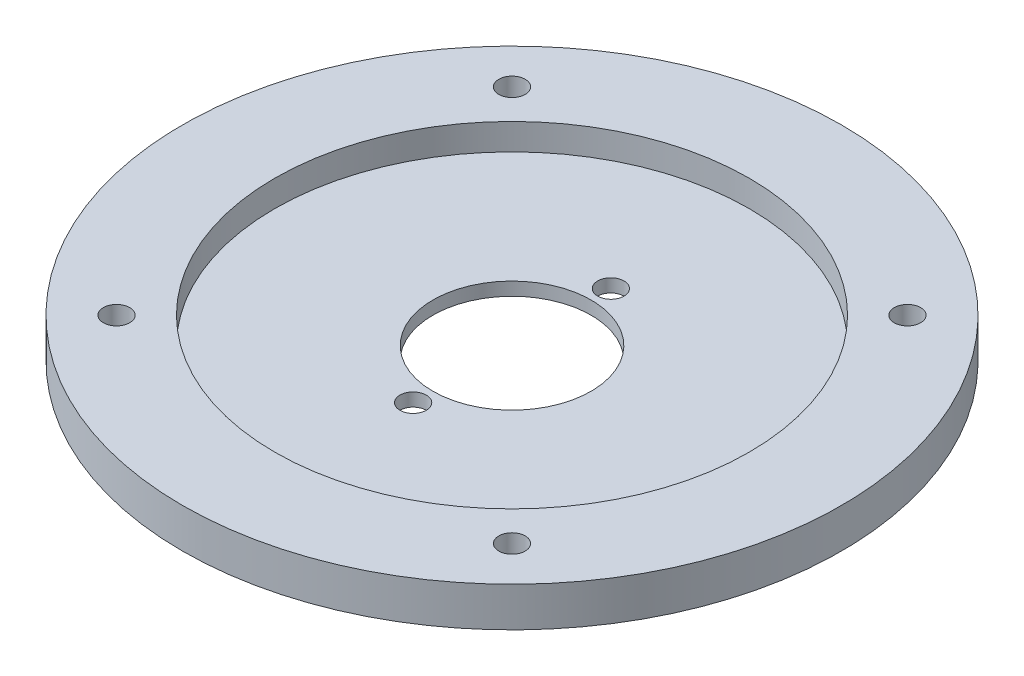
ISO-10303-21;
HEADER;
FILE_DESCRIPTION(('STEP AP214'),'2;1');
FILE_NAME('part.step','',(''),(''),'','','');
FILE_SCHEMA(('AUTOMOTIVE_DESIGN { 1 0 10303 214 1 1 1 1 }'));
ENDSEC;
DATA;
#1=APPLICATION_CONTEXT('core data for automotive mechanical design processes');
#2=APPLICATION_PROTOCOL_DEFINITION('international standard','automotive_design',2000,#1);
#3=PRODUCT_CONTEXT('',#1,'mechanical');
#4=PRODUCT('Part','Part','',(#3));
#5=PRODUCT_RELATED_PRODUCT_CATEGORY('part','',(#4));
#6=PRODUCT_DEFINITION_FORMATION('','',#4);
#7=PRODUCT_DEFINITION_CONTEXT('part definition',#1,'design');
#8=PRODUCT_DEFINITION('design','',#6,#7);
#9=PRODUCT_DEFINITION_SHAPE('','',#8);
#10=(LENGTH_UNIT() NAMED_UNIT(*) SI_UNIT(.MILLI.,.METRE.));
#11=(NAMED_UNIT(*) PLANE_ANGLE_UNIT() SI_UNIT($,.RADIAN.));
#12=(NAMED_UNIT(*) SI_UNIT($,.STERADIAN.) SOLID_ANGLE_UNIT());
#13=UNCERTAINTY_MEASURE_WITH_UNIT(LENGTH_MEASURE(1.E-05),#10,'distance_accuracy_value','');
#14=(GEOMETRIC_REPRESENTATION_CONTEXT(3) GLOBAL_UNCERTAINTY_ASSIGNED_CONTEXT((#13)) GLOBAL_UNIT_ASSIGNED_CONTEXT((#10,
#11,#12)) REPRESENTATION_CONTEXT('',''));
#15=CARTESIAN_POINT('',(0.,0.,0.));
#16=DIRECTION('',(0.,0.,1.));
#17=DIRECTION('',(1.,0.,0.));
#18=AXIS2_PLACEMENT_3D('',#15,#16,#17);
#19=CARTESIAN_POINT('',(0.,0.,0.));
#20=DIRECTION('',(0.,1.,0.));
#21=DIRECTION('',(0.,0.,1.));
#22=AXIS2_PLACEMENT_3D('',#19,#20,#21);
#23=CYLINDRICAL_SURFACE('',#22,6.);
#24=CARTESIAN_POINT('',(0.,0.,0.));
#25=DIRECTION('',(0.,1.,0.));
#26=DIRECTION('',(0.,0.,1.));
#27=AXIS2_PLACEMENT_3D('',#24,#25,#26);
#28=CIRCLE('',#27,6.);
#29=CARTESIAN_POINT('',(0.,0.,6.));
#30=VERTEX_POINT('',#29);
#31=EDGE_CURVE('E84',#30,#30,#28,.T.);
#32=ORIENTED_EDGE('',*,*,#31,.F.);
#33=EDGE_LOOP('',(#32));
#34=FACE_BOUND('',#33,.T.);
#35=CARTESIAN_POINT('',(0.,1.,0.));
#36=DIRECTION('',(0.,1.,0.));
#37=DIRECTION('',(0.,0.,1.));
#38=AXIS2_PLACEMENT_3D('',#35,#36,#37);
#39=CIRCLE('',#38,6.);
#40=CARTESIAN_POINT('',(0.,1.,6.));
#41=VERTEX_POINT('',#40);
#42=EDGE_CURVE('E109',#41,#41,#39,.F.);
#43=ORIENTED_EDGE('',*,*,#42,.F.);
#44=EDGE_LOOP('',(#43));
#45=FACE_BOUND('',#44,.T.);
#46=ADVANCED_FACE('F38',(#34,#45),#23,.F.);
#47=CARTESIAN_POINT('',(0.,0.,-7.5));
#48=DIRECTION('',(0.,1.,0.));
#49=DIRECTION('',(0.,0.,1.));
#50=AXIS2_PLACEMENT_3D('',#47,#48,#49);
#51=CYLINDRICAL_SURFACE('',#50,1.);
#52=CARTESIAN_POINT('',(0.,0.,-7.5));
#53=DIRECTION('',(0.,1.,0.));
#54=DIRECTION('',(0.,0.,1.));
#55=AXIS2_PLACEMENT_3D('',#52,#53,#54);
#56=CIRCLE('',#55,1.);
#57=CARTESIAN_POINT('',(0.,0.,-6.5));
#58=VERTEX_POINT('',#57);
#59=EDGE_CURVE('E91',#58,#58,#56,.T.);
#60=ORIENTED_EDGE('',*,*,#59,.F.);
#61=EDGE_LOOP('',(#60));
#62=FACE_BOUND('',#61,.T.);
#63=CARTESIAN_POINT('',(0.,1.,-7.5));
#64=DIRECTION('',(0.,1.,0.));
#65=DIRECTION('',(0.,0.,1.));
#66=AXIS2_PLACEMENT_3D('',#63,#64,#65);
#67=CIRCLE('',#66,1.);
#68=CARTESIAN_POINT('',(0.,1.,-6.5));
#69=VERTEX_POINT('',#68);
#70=EDGE_CURVE('E119',#69,#69,#67,.F.);
#71=ORIENTED_EDGE('',*,*,#70,.F.);
#72=EDGE_LOOP('',(#71));
#73=FACE_BOUND('',#72,.T.);
#74=ADVANCED_FACE('F142',(#62,#73),#51,.F.);
#75=CARTESIAN_POINT('',(0.,0.,7.5));
#76=DIRECTION('',(0.,1.,0.));
#77=DIRECTION('',(0.,0.,1.));
#78=AXIS2_PLACEMENT_3D('',#75,#76,#77);
#79=CYLINDRICAL_SURFACE('',#78,1.);
#80=CARTESIAN_POINT('',(0.,0.,7.5));
#81=DIRECTION('',(0.,1.,0.));
#82=DIRECTION('',(0.,0.,1.));
#83=AXIS2_PLACEMENT_3D('',#80,#81,#82);
#84=CIRCLE('',#83,1.);
#85=CARTESIAN_POINT('',(0.,0.,8.5));
#86=VERTEX_POINT('',#85);
#87=EDGE_CURVE('E92',#86,#86,#84,.T.);
#88=ORIENTED_EDGE('',*,*,#87,.F.);
#89=EDGE_LOOP('',(#88));
#90=FACE_BOUND('',#89,.T.);
#91=CARTESIAN_POINT('',(0.,1.,7.5));
#92=DIRECTION('',(0.,1.,0.));
#93=DIRECTION('',(0.,0.,1.));
#94=AXIS2_PLACEMENT_3D('',#91,#92,#93);
#95=CIRCLE('',#94,1.);
#96=CARTESIAN_POINT('',(0.,1.,8.5));
#97=VERTEX_POINT('',#96);
#98=EDGE_CURVE('E43',#97,#97,#95,.F.);
#99=ORIENTED_EDGE('',*,*,#98,.F.);
#100=EDGE_LOOP('',(#99));
#101=FACE_BOUND('',#100,.T.);
#102=ADVANCED_FACE('F139',(#90,#101),#79,.F.);
#103=CARTESIAN_POINT('',(0.,3.,0.));
#104=DIRECTION('',(0.,-1.,0.));
#105=DIRECTION('',(0.,0.,-1.));
#106=AXIS2_PLACEMENT_3D('',#103,#104,#105);
#107=CYLINDRICAL_SURFACE('',#106,25.);
#108=CARTESIAN_POINT('',(0.,3.,0.));
#109=DIRECTION('',(0.,1.,0.));
#110=DIRECTION('',(0.,0.,1.));
#111=AXIS2_PLACEMENT_3D('',#108,#109,#110);
#112=CIRCLE('',#111,25.);
#113=CARTESIAN_POINT('',(0.,3.,25.));
#114=VERTEX_POINT('',#113);
#115=EDGE_CURVE('E79',#114,#114,#112,.T.);
#116=ORIENTED_EDGE('',*,*,#115,.F.);
#117=EDGE_LOOP('',(#116));
#118=FACE_BOUND('',#117,.T.);
#119=CARTESIAN_POINT('',(0.,0.,0.));
#120=DIRECTION('',(0.,1.,0.));
#121=DIRECTION('',(0.,0.,1.));
#122=AXIS2_PLACEMENT_3D('',#119,#120,#121);
#123=CIRCLE('',#122,25.);
#124=CARTESIAN_POINT('',(0.,0.,25.));
#125=VERTEX_POINT('',#124);
#126=EDGE_CURVE('E80',#125,#125,#123,.T.);
#127=ORIENTED_EDGE('',*,*,#126,.T.);
#128=EDGE_LOOP('',(#127));
#129=FACE_BOUND('',#128,.T.);
#130=ADVANCED_FACE('F141',(#118,#129),#107,.T.);
#131=CARTESIAN_POINT('',(0.,3.,0.));
#132=DIRECTION('',(0.,1.,0.));
#133=DIRECTION('',(0.,0.,1.));
#134=AXIS2_PLACEMENT_3D('',#131,#132,#133);
#135=PLANE('',#134);
#136=CARTESIAN_POINT('',(0.,3.,0.));
#137=DIRECTION('',(0.,1.,0.));
#138=DIRECTION('',(0.,0.,1.));
#139=AXIS2_PLACEMENT_3D('',#136,#137,#138);
#140=CIRCLE('',#139,18.);
#141=CARTESIAN_POINT('',(0.,3.,18.));
#142=VERTEX_POINT('',#141);
#143=EDGE_CURVE('E123',#142,#142,#140,.T.);
#144=ORIENTED_EDGE('',*,*,#143,.F.);
#145=EDGE_LOOP('',(#144));
#146=FACE_BOUND('',#145,.T.);
#147=CARTESIAN_POINT('',(-15.,3.,15.));
#148=DIRECTION('',(0.,1.,0.));
#149=DIRECTION('',(0.,0.,1.));
#150=AXIS2_PLACEMENT_3D('',#147,#148,#149);
#151=CIRCLE('',#150,0.999999999999999);
#152=CARTESIAN_POINT('',(-15.,3.,16.));
#153=VERTEX_POINT('',#152);
#154=EDGE_CURVE('E104',#153,#153,#151,.T.);
#155=ORIENTED_EDGE('',*,*,#154,.F.);
#156=EDGE_LOOP('',(#155));
#157=FACE_BOUND('',#156,.T.);
#158=CARTESIAN_POINT('',(15.,3.,15.));
#159=DIRECTION('',(0.,1.,0.));
#160=DIRECTION('',(0.,0.,1.));
#161=AXIS2_PLACEMENT_3D('',#158,#159,#160);
#162=CIRCLE('',#161,1.);
#163=CARTESIAN_POINT('',(15.,3.,16.));
#164=VERTEX_POINT('',#163);
#165=EDGE_CURVE('E108',#164,#164,#162,.T.);
#166=ORIENTED_EDGE('',*,*,#165,.F.);
#167=EDGE_LOOP('',(#166));
#168=FACE_BOUND('',#167,.T.);
#169=CARTESIAN_POINT('',(15.,3.,-15.));
#170=DIRECTION('',(0.,1.,0.));
#171=DIRECTION('',(0.,0.,1.));
#172=AXIS2_PLACEMENT_3D('',#169,#170,#171);
#173=CIRCLE('',#172,1.);
#174=CARTESIAN_POINT('',(15.,3.,-14.));
#175=VERTEX_POINT('',#174);
#176=EDGE_CURVE('E103',#175,#175,#173,.T.);
#177=ORIENTED_EDGE('',*,*,#176,.F.);
#178=EDGE_LOOP('',(#177));
#179=FACE_BOUND('',#178,.T.);
#180=CARTESIAN_POINT('',(-15.,3.,-15.));
#181=DIRECTION('',(0.,1.,0.));
#182=DIRECTION('',(0.,0.,1.));
#183=AXIS2_PLACEMENT_3D('',#180,#181,#182);
#184=CIRCLE('',#183,1.);
#185=CARTESIAN_POINT('',(-15.,3.,-14.));
#186=VERTEX_POINT('',#185);
#187=EDGE_CURVE('E96',#186,#186,#184,.T.);
#188=ORIENTED_EDGE('',*,*,#187,.F.);
#189=EDGE_LOOP('',(#188));
#190=FACE_BOUND('',#189,.T.);
#191=ORIENTED_EDGE('',*,*,#115,.T.);
#192=EDGE_LOOP('',(#191));
#193=FACE_BOUND('',#192,.T.);
#194=ADVANCED_FACE('F150',(#146,#157,#168,#179,#190,#193),#135,.T.);
#195=CARTESIAN_POINT('',(0.,0.,0.));
#196=DIRECTION('',(0.,1.,0.));
#197=DIRECTION('',(0.,0.,1.));
#198=AXIS2_PLACEMENT_3D('',#195,#196,#197);
#199=PLANE('',#198);
#200=CARTESIAN_POINT('',(-15.,0.,-15.));
#201=DIRECTION('',(0.,1.,0.));
#202=DIRECTION('',(0.,0.,1.));
#203=AXIS2_PLACEMENT_3D('',#200,#201,#202);
#204=CIRCLE('',#203,2.);
#205=CARTESIAN_POINT('',(-15.,0.,-13.));
#206=VERTEX_POINT('',#205);
#207=EDGE_CURVE('E63',#206,#206,#204,.T.);
#208=ORIENTED_EDGE('',*,*,#207,.T.);
#209=EDGE_LOOP('',(#208));
#210=FACE_BOUND('',#209,.T.);
#211=CARTESIAN_POINT('',(15.,0.,-15.));
#212=DIRECTION('',(0.,1.,0.));
#213=DIRECTION('',(0.,0.,1.));
#214=AXIS2_PLACEMENT_3D('',#211,#212,#213);
#215=CIRCLE('',#214,2.);
#216=CARTESIAN_POINT('',(15.,0.,-13.));
#217=VERTEX_POINT('',#216);
#218=EDGE_CURVE('E67',#217,#217,#215,.T.);
#219=ORIENTED_EDGE('',*,*,#218,.T.);
#220=EDGE_LOOP('',(#219));
#221=FACE_BOUND('',#220,.T.);
#222=CARTESIAN_POINT('',(15.,0.,15.));
#223=DIRECTION('',(0.,1.,0.));
#224=DIRECTION('',(0.,0.,1.));
#225=AXIS2_PLACEMENT_3D('',#222,#223,#224);
#226=CIRCLE('',#225,2.);
#227=CARTESIAN_POINT('',(15.,0.,17.));
#228=VERTEX_POINT('',#227);
#229=EDGE_CURVE('E71',#228,#228,#226,.T.);
#230=ORIENTED_EDGE('',*,*,#229,.T.);
#231=EDGE_LOOP('',(#230));
#232=FACE_BOUND('',#231,.T.);
#233=CARTESIAN_POINT('',(-15.,0.,15.));
#234=DIRECTION('',(0.,1.,0.));
#235=DIRECTION('',(0.,0.,1.));
#236=AXIS2_PLACEMENT_3D('',#233,#234,#235);
#237=CIRCLE('',#236,2.00000000000002);
#238=CARTESIAN_POINT('',(-15.,0.,17.));
#239=VERTEX_POINT('',#238);
#240=EDGE_CURVE('E75',#239,#239,#237,.T.);
#241=ORIENTED_EDGE('',*,*,#240,.T.);
#242=EDGE_LOOP('',(#241));
#243=FACE_BOUND('',#242,.T.);
#244=ORIENTED_EDGE('',*,*,#87,.T.);
#245=EDGE_LOOP('',(#244));
#246=FACE_BOUND('',#245,.T.);
#247=ORIENTED_EDGE('',*,*,#59,.T.);
#248=EDGE_LOOP('',(#247));
#249=FACE_BOUND('',#248,.T.);
#250=ORIENTED_EDGE('',*,*,#31,.T.);
#251=EDGE_LOOP('',(#250));
#252=FACE_BOUND('',#251,.T.);
#253=ORIENTED_EDGE('',*,*,#126,.F.);
#254=EDGE_LOOP('',(#253));
#255=FACE_BOUND('',#254,.T.);
#256=ADVANCED_FACE('F166',(#210,#221,#232,#243,#246,#249,#252,#255),#199,.F.);
#257=CARTESIAN_POINT('',(-15.,0.,-15.));
#258=DIRECTION('',(0.,1.,0.));
#259=DIRECTION('',(0.,0.,1.));
#260=AXIS2_PLACEMENT_3D('',#257,#258,#259);
#261=CYLINDRICAL_SURFACE('',#260,1.);
#262=CARTESIAN_POINT('',(-15.,1.,-15.));
#263=DIRECTION('',(0.,1.,0.));
#264=DIRECTION('',(0.,0.,1.));
#265=AXIS2_PLACEMENT_3D('',#262,#263,#264);
#266=CIRCLE('',#265,1.);
#267=CARTESIAN_POINT('',(-15.,1.,-14.));
#268=VERTEX_POINT('',#267);
#269=EDGE_CURVE('E59',#268,#268,#266,.F.);
#270=ORIENTED_EDGE('',*,*,#269,.T.);
#271=EDGE_LOOP('',(#270));
#272=FACE_BOUND('',#271,.T.);
#273=ORIENTED_EDGE('',*,*,#187,.T.);
#274=EDGE_LOOP('',(#273));
#275=FACE_BOUND('',#274,.T.);
#276=ADVANCED_FACE('F169',(#272,#275),#261,.F.);
#277=CARTESIAN_POINT('',(15.,0.,-15.));
#278=DIRECTION('',(0.,1.,0.));
#279=DIRECTION('',(0.,0.,1.));
#280=AXIS2_PLACEMENT_3D('',#277,#278,#279);
#281=CYLINDRICAL_SURFACE('',#280,1.);
#282=CARTESIAN_POINT('',(15.,1.,-15.));
#283=DIRECTION('',(0.,1.,0.));
#284=DIRECTION('',(0.,0.,1.));
#285=AXIS2_PLACEMENT_3D('',#282,#283,#284);
#286=CIRCLE('',#285,1.);
#287=CARTESIAN_POINT('',(15.,1.,-14.));
#288=VERTEX_POINT('',#287);
#289=EDGE_CURVE('E53',#288,#288,#286,.F.);
#290=ORIENTED_EDGE('',*,*,#289,.T.);
#291=EDGE_LOOP('',(#290));
#292=FACE_BOUND('',#291,.T.);
#293=ORIENTED_EDGE('',*,*,#176,.T.);
#294=EDGE_LOOP('',(#293));
#295=FACE_BOUND('',#294,.T.);
#296=ADVANCED_FACE('F223',(#292,#295),#281,.F.);
#297=CARTESIAN_POINT('',(15.,0.,15.));
#298=DIRECTION('',(0.,1.,0.));
#299=DIRECTION('',(0.,0.,1.));
#300=AXIS2_PLACEMENT_3D('',#297,#298,#299);
#301=CYLINDRICAL_SURFACE('',#300,1.);
#302=CARTESIAN_POINT('',(15.,1.,15.));
#303=DIRECTION('',(0.,1.,0.));
#304=DIRECTION('',(0.,0.,1.));
#305=AXIS2_PLACEMENT_3D('',#302,#303,#304);
#306=CIRCLE('',#305,1.);
#307=CARTESIAN_POINT('',(15.,1.,16.));
#308=VERTEX_POINT('',#307);
#309=EDGE_CURVE('E48',#308,#308,#306,.F.);
#310=ORIENTED_EDGE('',*,*,#309,.T.);
#311=EDGE_LOOP('',(#310));
#312=FACE_BOUND('',#311,.T.);
#313=ORIENTED_EDGE('',*,*,#165,.T.);
#314=EDGE_LOOP('',(#313));
#315=FACE_BOUND('',#314,.T.);
#316=ADVANCED_FACE('F226',(#312,#315),#301,.F.);
#317=CARTESIAN_POINT('',(-15.,0.,15.));
#318=DIRECTION('',(0.,1.,0.));
#319=DIRECTION('',(0.,0.,1.));
#320=AXIS2_PLACEMENT_3D('',#317,#318,#319);
#321=CYLINDRICAL_SURFACE('',#320,0.999999999999999);
#322=CARTESIAN_POINT('',(-15.,1.00000000000003,15.));
#323=DIRECTION('',(0.,1.,0.));
#324=DIRECTION('',(0.,0.,1.));
#325=AXIS2_PLACEMENT_3D('',#322,#323,#324);
#326=CIRCLE('',#325,0.999999999999999);
#327=CARTESIAN_POINT('',(-15.,1.00000000000003,16.));
#328=VERTEX_POINT('',#327);
#329=EDGE_CURVE('E10',#328,#328,#326,.F.);
#330=ORIENTED_EDGE('',*,*,#329,.T.);
#331=EDGE_LOOP('',(#330));
#332=FACE_BOUND('',#331,.T.);
#333=ORIENTED_EDGE('',*,*,#154,.T.);
#334=EDGE_LOOP('',(#333));
#335=FACE_BOUND('',#334,.T.);
#336=ADVANCED_FACE('F180',(#332,#335),#321,.F.);
#337=CARTESIAN_POINT('',(-15.,0.,-15.));
#338=DIRECTION('',(0.,-1.,0.));
#339=DIRECTION('',(0.,0.,-1.));
#340=AXIS2_PLACEMENT_3D('',#337,#338,#339);
#341=CONICAL_SURFACE('',#340,2.,0.785398163397446);
#342=ORIENTED_EDGE('',*,*,#269,.F.);
#343=EDGE_LOOP('',(#342));
#344=FACE_BOUND('',#343,.T.);
#345=ORIENTED_EDGE('',*,*,#207,.F.);
#346=EDGE_LOOP('',(#345));
#347=FACE_BOUND('',#346,.T.);
#348=ADVANCED_FACE('F173',(#344,#347),#341,.F.);
#349=CARTESIAN_POINT('',(15.,0.,-15.));
#350=DIRECTION('',(0.,-1.,0.));
#351=DIRECTION('',(0.,0.,-1.));
#352=AXIS2_PLACEMENT_3D('',#349,#350,#351);
#353=CONICAL_SURFACE('',#352,2.,0.785398163397446);
#354=ORIENTED_EDGE('',*,*,#289,.F.);
#355=EDGE_LOOP('',(#354));
#356=FACE_BOUND('',#355,.T.);
#357=ORIENTED_EDGE('',*,*,#218,.F.);
#358=EDGE_LOOP('',(#357));
#359=FACE_BOUND('',#358,.T.);
#360=ADVANCED_FACE('F179',(#356,#359),#353,.F.);
#361=CARTESIAN_POINT('',(15.,0.,15.));
#362=DIRECTION('',(0.,-1.,0.));
#363=DIRECTION('',(0.,0.,-1.));
#364=AXIS2_PLACEMENT_3D('',#361,#362,#363);
#365=CONICAL_SURFACE('',#364,2.,0.785398163397447);
#366=ORIENTED_EDGE('',*,*,#309,.F.);
#367=EDGE_LOOP('',(#366));
#368=FACE_BOUND('',#367,.T.);
#369=ORIENTED_EDGE('',*,*,#229,.F.);
#370=EDGE_LOOP('',(#369));
#371=FACE_BOUND('',#370,.T.);
#372=ADVANCED_FACE('F186',(#368,#371),#365,.F.);
#373=CARTESIAN_POINT('',(-15.,0.,15.));
#374=DIRECTION('',(0.,-1.,0.));
#375=DIRECTION('',(0.,0.,-1.));
#376=AXIS2_PLACEMENT_3D('',#373,#374,#375);
#377=CONICAL_SURFACE('',#376,2.00000000000002,0.785398163397443);
#378=ORIENTED_EDGE('',*,*,#329,.F.);
#379=EDGE_LOOP('',(#378));
#380=FACE_BOUND('',#379,.T.);
#381=ORIENTED_EDGE('',*,*,#240,.F.);
#382=EDGE_LOOP('',(#381));
#383=FACE_BOUND('',#382,.T.);
#384=ADVANCED_FACE('F41',(#380,#383),#377,.F.);
#385=CARTESIAN_POINT('',(0.,1.,0.));
#386=DIRECTION('',(0.,1.,0.));
#387=DIRECTION('',(0.,0.,1.));
#388=AXIS2_PLACEMENT_3D('',#385,#386,#387);
#389=PLANE('',#388);
#390=CARTESIAN_POINT('',(0.,1.,0.));
#391=DIRECTION('',(0.,1.,0.));
#392=DIRECTION('',(0.,0.,1.));
#393=AXIS2_PLACEMENT_3D('',#390,#391,#392);
#394=CIRCLE('',#393,18.);
#395=CARTESIAN_POINT('',(0.,1.,18.));
#396=VERTEX_POINT('',#395);
#397=EDGE_CURVE('E127',#396,#396,#394,.T.);
#398=ORIENTED_EDGE('',*,*,#397,.T.);
#399=EDGE_LOOP('',(#398));
#400=FACE_BOUND('',#399,.T.);
#401=ORIENTED_EDGE('',*,*,#98,.T.);
#402=EDGE_LOOP('',(#401));
#403=FACE_BOUND('',#402,.T.);
#404=ORIENTED_EDGE('',*,*,#70,.T.);
#405=EDGE_LOOP('',(#404));
#406=FACE_BOUND('',#405,.T.);
#407=ORIENTED_EDGE('',*,*,#42,.T.);
#408=EDGE_LOOP('',(#407));
#409=FACE_BOUND('',#408,.T.);
#410=ADVANCED_FACE('F136',(#400,#403,#406,#409),#389,.T.);
#411=CARTESIAN_POINT('',(0.,1.,0.));
#412=DIRECTION('',(0.,1.,0.));
#413=DIRECTION('',(0.,0.,1.));
#414=AXIS2_PLACEMENT_3D('',#411,#412,#413);
#415=CYLINDRICAL_SURFACE('',#414,18.);
#416=ORIENTED_EDGE('',*,*,#397,.F.);
#417=EDGE_LOOP('',(#416));
#418=FACE_BOUND('',#417,.T.);
#419=ORIENTED_EDGE('',*,*,#143,.T.);
#420=EDGE_LOOP('',(#419));
#421=FACE_BOUND('',#420,.T.);
#422=ADVANCED_FACE('F213',(#418,#421),#415,.F.);
#423=CLOSED_SHELL('',(#46,#74,#102,#130,#194,#256,#276,#296,#316,#336,#348,#360,#372,#384,#410,#422));
#424=MANIFOLD_SOLID_BREP('B2',#423);
#425=ADVANCED_BREP_SHAPE_REPRESENTATION('',(#18,#424),#14);
#426=SHAPE_DEFINITION_REPRESENTATION(#9,#425);
ENDSEC;
END-ISO-10303-21;
